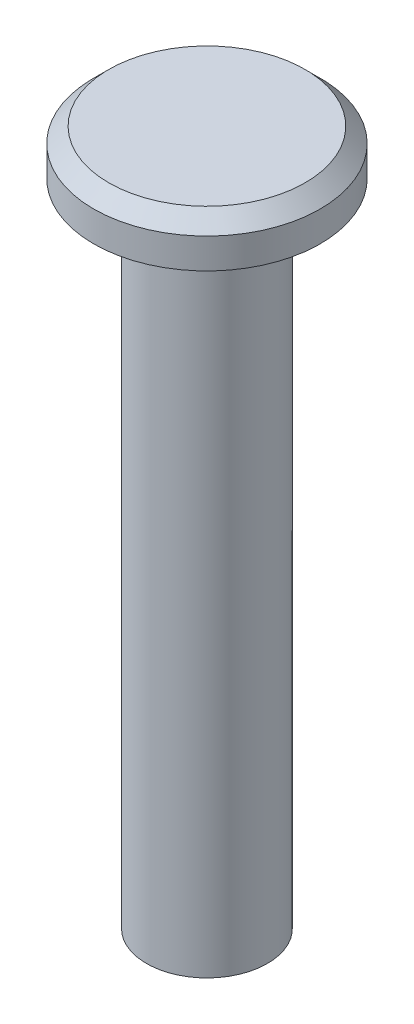
ISO-10303-21;
HEADER;
FILE_DESCRIPTION(('STEP AP214'),'2;1');
FILE_NAME('part.step','',(''),(''),'','','');
FILE_SCHEMA(('AUTOMOTIVE_DESIGN { 1 0 10303 214 1 1 1 1 }'));
ENDSEC;
DATA;
#1=APPLICATION_CONTEXT('core data for automotive mechanical design processes');
#2=APPLICATION_PROTOCOL_DEFINITION('international standard','automotive_design',2000,#1);
#3=PRODUCT_CONTEXT('',#1,'mechanical');
#4=PRODUCT('Part','Part','',(#3));
#5=PRODUCT_RELATED_PRODUCT_CATEGORY('part','',(#4));
#6=PRODUCT_DEFINITION_FORMATION('','',#4);
#7=PRODUCT_DEFINITION_CONTEXT('part definition',#1,'design');
#8=PRODUCT_DEFINITION('design','',#6,#7);
#9=PRODUCT_DEFINITION_SHAPE('','',#8);
#10=(LENGTH_UNIT() NAMED_UNIT(*) SI_UNIT(.MILLI.,.METRE.));
#11=(NAMED_UNIT(*) PLANE_ANGLE_UNIT() SI_UNIT($,.RADIAN.));
#12=(NAMED_UNIT(*) SI_UNIT($,.STERADIAN.) SOLID_ANGLE_UNIT());
#13=UNCERTAINTY_MEASURE_WITH_UNIT(LENGTH_MEASURE(1.E-05),#10,'distance_accuracy_value','');
#14=(GEOMETRIC_REPRESENTATION_CONTEXT(3) GLOBAL_UNCERTAINTY_ASSIGNED_CONTEXT((#13)) GLOBAL_UNIT_ASSIGNED_CONTEXT((#10,
#11,#12)) REPRESENTATION_CONTEXT('',''));
#15=CARTESIAN_POINT('',(0.,0.,0.));
#16=DIRECTION('',(0.,0.,1.));
#17=DIRECTION('',(1.,0.,0.));
#18=AXIS2_PLACEMENT_3D('',#15,#16,#17);
#19=CARTESIAN_POINT('',(0.,3.,0.));
#20=DIRECTION('',(0.,-1.,0.));
#21=DIRECTION('',(0.,0.,-1.));
#22=AXIS2_PLACEMENT_3D('',#19,#20,#21);
#23=CYLINDRICAL_SURFACE('',#22,7.5);
#24=CARTESIAN_POINT('',(0.,1.99999999999999,0.));
#25=DIRECTION('',(0.,1.,0.));
#26=DIRECTION('',(0.,0.,1.));
#27=AXIS2_PLACEMENT_3D('',#24,#25,#26);
#28=CIRCLE('',#27,7.5);
#29=CARTESIAN_POINT('',(0.,1.99999999999999,7.5));
#30=VERTEX_POINT('',#29);
#31=EDGE_CURVE('E10',#30,#30,#28,.F.);
#32=ORIENTED_EDGE('',*,*,#31,.T.);
#33=EDGE_LOOP('',(#32));
#34=FACE_BOUND('',#33,.T.);
#35=CARTESIAN_POINT('',(0.,0.,0.));
#36=DIRECTION('',(0.,1.,0.));
#37=DIRECTION('',(0.,0.,1.));
#38=AXIS2_PLACEMENT_3D('',#35,#36,#37);
#39=CIRCLE('',#38,7.5);
#40=CARTESIAN_POINT('',(0.,0.,7.5));
#41=VERTEX_POINT('',#40);
#42=EDGE_CURVE('E64',#41,#41,#39,.T.);
#43=ORIENTED_EDGE('',*,*,#42,.T.);
#44=EDGE_LOOP('',(#43));
#45=FACE_BOUND('',#44,.T.);
#46=ADVANCED_FACE('F45',(#34,#45),#23,.T.);
#47=CARTESIAN_POINT('',(0.,3.,0.));
#48=DIRECTION('',(0.,1.,0.));
#49=DIRECTION('',(0.,0.,1.));
#50=AXIS2_PLACEMENT_3D('',#47,#48,#49);
#51=PLANE('',#50);
#52=CARTESIAN_POINT('',(0.,3.,0.));
#53=DIRECTION('',(0.,1.,0.));
#54=DIRECTION('',(0.,0.,1.));
#55=AXIS2_PLACEMENT_3D('',#52,#53,#54);
#56=CIRCLE('',#55,6.49999999999999);
#57=CARTESIAN_POINT('',(0.,3.,6.49999999999999));
#58=VERTEX_POINT('',#57);
#59=EDGE_CURVE('E54',#58,#58,#56,.T.);
#60=ORIENTED_EDGE('',*,*,#59,.T.);
#61=EDGE_LOOP('',(#60));
#62=FACE_BOUND('',#61,.T.);
#63=ADVANCED_FACE('F86',(#62),#51,.T.);
#64=CARTESIAN_POINT('',(0.,0.,0.));
#65=DIRECTION('',(0.,1.,0.));
#66=DIRECTION('',(0.,0.,1.));
#67=AXIS2_PLACEMENT_3D('',#64,#65,#66);
#68=PLANE('',#67);
#69=CARTESIAN_POINT('',(0.,0.,0.));
#70=DIRECTION('',(0.,-1.,0.));
#71=DIRECTION('',(0.,0.,-1.));
#72=AXIS2_PLACEMENT_3D('',#69,#70,#71);
#73=CIRCLE('',#72,4.);
#74=CARTESIAN_POINT('',(0.,0.,-4.));
#75=VERTEX_POINT('',#74);
#76=EDGE_CURVE('E59',#75,#75,#73,.T.);
#77=ORIENTED_EDGE('',*,*,#76,.F.);
#78=EDGE_LOOP('',(#77));
#79=FACE_BOUND('',#78,.T.);
#80=ORIENTED_EDGE('',*,*,#42,.F.);
#81=EDGE_LOOP('',(#80));
#82=FACE_BOUND('',#81,.T.);
#83=ADVANCED_FACE('F80',(#79,#82),#68,.F.);
#84=CARTESIAN_POINT('',(0.,-43.,0.));
#85=DIRECTION('',(0.,1.,0.));
#86=DIRECTION('',(0.,0.,1.));
#87=AXIS2_PLACEMENT_3D('',#84,#85,#86);
#88=CYLINDRICAL_SURFACE('',#87,4.);
#89=CARTESIAN_POINT('',(0.,-43.,0.));
#90=DIRECTION('',(0.,-1.,0.));
#91=DIRECTION('',(0.,0.,-1.));
#92=AXIS2_PLACEMENT_3D('',#89,#90,#91);
#93=CIRCLE('',#92,4.);
#94=CARTESIAN_POINT('',(0.,-43.,-4.));
#95=VERTEX_POINT('',#94);
#96=EDGE_CURVE('E69',#95,#95,#93,.T.);
#97=ORIENTED_EDGE('',*,*,#96,.F.);
#98=EDGE_LOOP('',(#97));
#99=FACE_BOUND('',#98,.T.);
#100=ORIENTED_EDGE('',*,*,#76,.T.);
#101=EDGE_LOOP('',(#100));
#102=FACE_BOUND('',#101,.T.);
#103=ADVANCED_FACE('F77',(#99,#102),#88,.T.);
#104=CARTESIAN_POINT('',(0.,-43.,0.));
#105=DIRECTION('',(0.,-1.,0.));
#106=DIRECTION('',(0.,0.,-1.));
#107=AXIS2_PLACEMENT_3D('',#104,#105,#106);
#108=PLANE('',#107);
#109=ORIENTED_EDGE('',*,*,#96,.T.);
#110=EDGE_LOOP('',(#109));
#111=FACE_BOUND('',#110,.T.);
#112=ADVANCED_FACE('F75',(#111),#108,.T.);
#113=CARTESIAN_POINT('',(0.,3.,0.));
#114=DIRECTION('',(0.,-1.,0.));
#115=DIRECTION('',(0.,0.,-1.));
#116=AXIS2_PLACEMENT_3D('',#113,#114,#115);
#117=CONICAL_SURFACE('',#116,6.49999999999999,0.78539816339745);
#118=ORIENTED_EDGE('',*,*,#31,.F.);
#119=EDGE_LOOP('',(#118));
#120=FACE_BOUND('',#119,.T.);
#121=ORIENTED_EDGE('',*,*,#59,.F.);
#122=EDGE_LOOP('',(#121));
#123=FACE_BOUND('',#122,.T.);
#124=ADVANCED_FACE('F48',(#120,#123),#117,.T.);
#125=CLOSED_SHELL('',(#46,#63,#83,#103,#112,#124));
#126=MANIFOLD_SOLID_BREP('B2',#125);
#127=ADVANCED_BREP_SHAPE_REPRESENTATION('',(#18,#126),#14);
#128=SHAPE_DEFINITION_REPRESENTATION(#9,#127);
ENDSEC;
END-ISO-10303-21;
